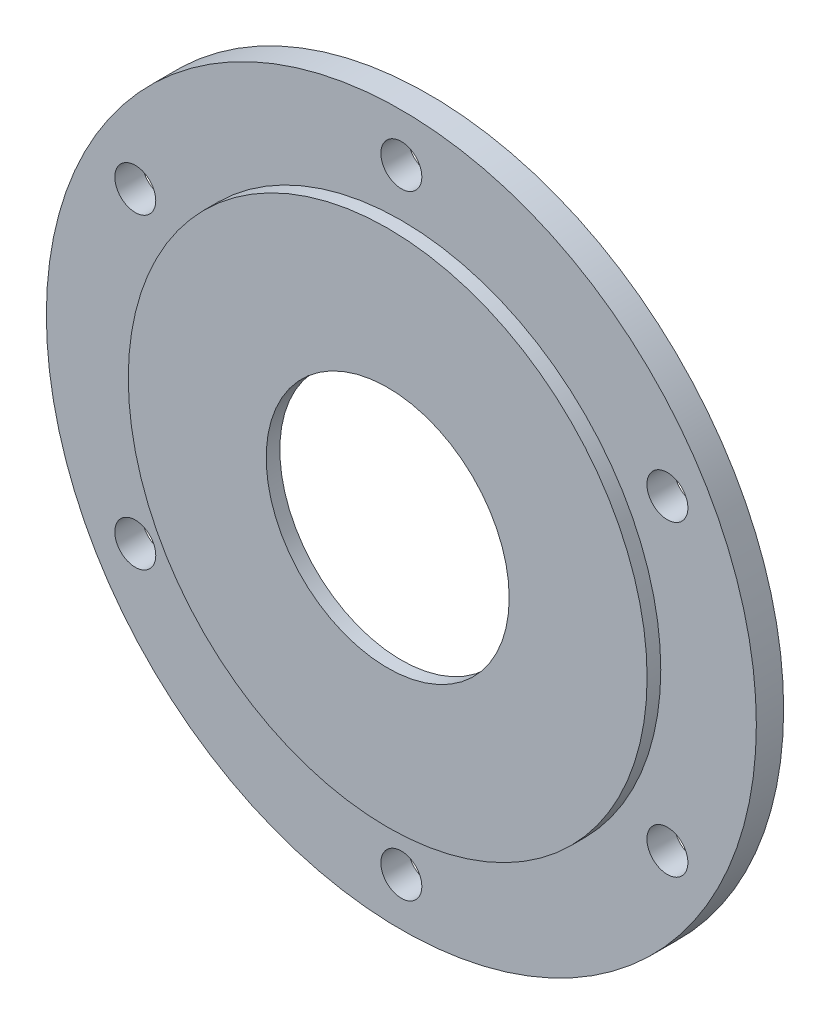
ISO-10303-21;
HEADER;
FILE_DESCRIPTION(('STEP AP214'),'2;1');
FILE_NAME('part.step','',(''),(''),'','','');
FILE_SCHEMA(('AUTOMOTIVE_DESIGN { 1 0 10303 214 1 1 1 1 }'));
ENDSEC;
DATA;
#1=APPLICATION_CONTEXT('core data for automotive mechanical design processes');
#2=APPLICATION_PROTOCOL_DEFINITION('international standard','automotive_design',2000,#1);
#3=PRODUCT_CONTEXT('',#1,'mechanical');
#4=PRODUCT('Part','Part','',(#3));
#5=PRODUCT_RELATED_PRODUCT_CATEGORY('part','',(#4));
#6=PRODUCT_DEFINITION_FORMATION('','',#4);
#7=PRODUCT_DEFINITION_CONTEXT('part definition',#1,'design');
#8=PRODUCT_DEFINITION('design','',#6,#7);
#9=PRODUCT_DEFINITION_SHAPE('','',#8);
#10=(LENGTH_UNIT() NAMED_UNIT(*) SI_UNIT(.MILLI.,.METRE.));
#11=(NAMED_UNIT(*) PLANE_ANGLE_UNIT() SI_UNIT($,.RADIAN.));
#12=(NAMED_UNIT(*) SI_UNIT($,.STERADIAN.) SOLID_ANGLE_UNIT());
#13=UNCERTAINTY_MEASURE_WITH_UNIT(LENGTH_MEASURE(1.E-05),#10,'distance_accuracy_value','');
#14=(GEOMETRIC_REPRESENTATION_CONTEXT(3) GLOBAL_UNCERTAINTY_ASSIGNED_CONTEXT((#13)) GLOBAL_UNIT_ASSIGNED_CONTEXT((#10,
#11,#12)) REPRESENTATION_CONTEXT('',''));
#15=CARTESIAN_POINT('',(0.,0.,0.));
#16=DIRECTION('',(0.,0.,1.));
#17=DIRECTION('',(1.,0.,0.));
#18=AXIS2_PLACEMENT_3D('',#15,#16,#17);
#19=CARTESIAN_POINT('',(0.,0.,-2.));
#20=DIRECTION('',(0.,0.,-1.));
#21=DIRECTION('',(-1.,0.,0.));
#22=AXIS2_PLACEMENT_3D('',#19,#20,#21);
#23=PLANE('',#22);
#24=CARTESIAN_POINT('',(0.,22.5,-2.));
#25=DIRECTION('',(0.,0.,-1.));
#26=DIRECTION('',(-1.,0.,0.));
#27=AXIS2_PLACEMENT_3D('',#24,#25,#26);
#28=CIRCLE('',#27,1.5);
#29=CARTESIAN_POINT('',(-1.5,22.5,-2.));
#30=VERTEX_POINT('',#29);
#31=EDGE_CURVE('E64',#30,#30,#28,.T.);
#32=ORIENTED_EDGE('',*,*,#31,.F.);
#33=EDGE_LOOP('',(#32));
#34=FACE_BOUND('',#33,.T.);
#35=CARTESIAN_POINT('',(-19.4855715851494,11.2499999999992,-2.));
#36=DIRECTION('',(0.,0.,-1.));
#37=DIRECTION('',(-1.,0.,0.));
#38=AXIS2_PLACEMENT_3D('',#35,#36,#37);
#39=CIRCLE('',#38,1.5);
#40=CARTESIAN_POINT('',(-20.9855715851494,11.2499999999992,-2.));
#41=VERTEX_POINT('',#40);
#42=EDGE_CURVE('E71',#41,#41,#39,.T.);
#43=ORIENTED_EDGE('',*,*,#42,.F.);
#44=EDGE_LOOP('',(#43));
#45=FACE_BOUND('',#44,.T.);
#46=CARTESIAN_POINT('',(-19.4855715851484,-11.2500000000008,-2.));
#47=DIRECTION('',(0.,0.,-1.));
#48=DIRECTION('',(-1.,0.,0.));
#49=AXIS2_PLACEMENT_3D('',#46,#47,#48);
#50=CIRCLE('',#49,1.5);
#51=CARTESIAN_POINT('',(-20.9855715851484,-11.2500000000008,-2.));
#52=VERTEX_POINT('',#51);
#53=EDGE_CURVE('E75',#52,#52,#50,.T.);
#54=ORIENTED_EDGE('',*,*,#53,.F.);
#55=EDGE_LOOP('',(#54));
#56=FACE_BOUND('',#55,.T.);
#57=CARTESIAN_POINT('',(1.9099540912982E-12,-22.5,-2.));
#58=DIRECTION('',(0.,0.,-1.));
#59=DIRECTION('',(-1.,0.,0.));
#60=AXIS2_PLACEMENT_3D('',#57,#58,#59);
#61=CIRCLE('',#60,1.5);
#62=CARTESIAN_POINT('',(-1.49999999999809,-22.5,-2.));
#63=VERTEX_POINT('',#62);
#64=EDGE_CURVE('E79',#63,#63,#61,.T.);
#65=ORIENTED_EDGE('',*,*,#64,.F.);
#66=EDGE_LOOP('',(#65));
#67=FACE_BOUND('',#66,.T.);
#68=CARTESIAN_POINT('',(19.4855715851513,-11.2499999999992,-2.));
#69=DIRECTION('',(0.,0.,-1.));
#70=DIRECTION('',(-1.,0.,0.));
#71=AXIS2_PLACEMENT_3D('',#68,#69,#70);
#72=CIRCLE('',#71,1.5);
#73=CARTESIAN_POINT('',(17.9855715851513,-11.2499999999992,-2.));
#74=VERTEX_POINT('',#73);
#75=EDGE_CURVE('E83',#74,#74,#72,.T.);
#76=ORIENTED_EDGE('',*,*,#75,.F.);
#77=EDGE_LOOP('',(#76));
#78=FACE_BOUND('',#77,.T.);
#79=CARTESIAN_POINT('',(19.4855715851503,11.2500000000008,-2.));
#80=DIRECTION('',(0.,0.,-1.));
#81=DIRECTION('',(-1.,0.,0.));
#82=AXIS2_PLACEMENT_3D('',#79,#80,#81);
#83=CIRCLE('',#82,1.5);
#84=CARTESIAN_POINT('',(17.9855715851503,11.2500000000008,-2.));
#85=VERTEX_POINT('',#84);
#86=EDGE_CURVE('E87',#85,#85,#83,.T.);
#87=ORIENTED_EDGE('',*,*,#86,.F.);
#88=EDGE_LOOP('',(#87));
#89=FACE_BOUND('',#88,.T.);
#90=CARTESIAN_POINT('',(0.,0.,-2.));
#91=DIRECTION('',(0.,0.,-1.));
#92=DIRECTION('',(-1.,0.,0.));
#93=AXIS2_PLACEMENT_3D('',#90,#91,#92);
#94=CIRCLE('',#93,26.);
#95=CARTESIAN_POINT('',(-26.,0.,-2.));
#96=VERTEX_POINT('',#95);
#97=EDGE_CURVE('E11',#96,#96,#94,.T.);
#98=ORIENTED_EDGE('',*,*,#97,.T.);
#99=EDGE_LOOP('',(#98));
#100=FACE_BOUND('',#99,.T.);
#101=CARTESIAN_POINT('',(0.,0.,-2.));
#102=DIRECTION('',(0.,0.,-1.));
#103=DIRECTION('',(-1.,0.,0.));
#104=AXIS2_PLACEMENT_3D('',#101,#102,#103);
#105=CIRCLE('',#104,19.);
#106=CARTESIAN_POINT('',(-19.,0.,-2.));
#107=VERTEX_POINT('',#106);
#108=EDGE_CURVE('E58',#107,#107,#105,.T.);
#109=ORIENTED_EDGE('',*,*,#108,.F.);
#110=EDGE_LOOP('',(#109));
#111=FACE_BOUND('',#110,.T.);
#112=ADVANCED_FACE('F45',(#34,#45,#56,#67,#78,#89,#100,#111),#23,.T.);
#113=CARTESIAN_POINT('',(0.,0.,0.));
#114=DIRECTION('',(0.,0.,-1.));
#115=DIRECTION('',(-1.,0.,0.));
#116=AXIS2_PLACEMENT_3D('',#113,#114,#115);
#117=PLANE('',#116);
#118=CARTESIAN_POINT('',(0.,22.5,0.));
#119=DIRECTION('',(0.,0.,1.));
#120=DIRECTION('',(1.,0.,0.));
#121=AXIS2_PLACEMENT_3D('',#118,#119,#120);
#122=CIRCLE('',#121,1.5);
#123=CARTESIAN_POINT('',(1.5,22.5,0.));
#124=VERTEX_POINT('',#123);
#125=EDGE_CURVE('E91',#124,#124,#122,.T.);
#126=ORIENTED_EDGE('',*,*,#125,.F.);
#127=EDGE_LOOP('',(#126));
#128=FACE_BOUND('',#127,.T.);
#129=CARTESIAN_POINT('',(-19.4855715851494,11.2499999999992,0.));
#130=DIRECTION('',(0.,0.,1.));
#131=DIRECTION('',(1.,0.,0.));
#132=AXIS2_PLACEMENT_3D('',#129,#130,#131);
#133=CIRCLE('',#132,1.5);
#134=CARTESIAN_POINT('',(-17.9855715851494,11.2499999999992,0.));
#135=VERTEX_POINT('',#134);
#136=EDGE_CURVE('E97',#135,#135,#133,.T.);
#137=ORIENTED_EDGE('',*,*,#136,.F.);
#138=EDGE_LOOP('',(#137));
#139=FACE_BOUND('',#138,.T.);
#140=CARTESIAN_POINT('',(-19.4855715851484,-11.2500000000008,0.));
#141=DIRECTION('',(0.,0.,1.));
#142=DIRECTION('',(1.,0.,0.));
#143=AXIS2_PLACEMENT_3D('',#140,#141,#142);
#144=CIRCLE('',#143,1.5);
#145=CARTESIAN_POINT('',(-17.9855715851484,-11.2500000000008,0.));
#146=VERTEX_POINT('',#145);
#147=EDGE_CURVE('E92',#146,#146,#144,.T.);
#148=ORIENTED_EDGE('',*,*,#147,.F.);
#149=EDGE_LOOP('',(#148));
#150=FACE_BOUND('',#149,.T.);
#151=CARTESIAN_POINT('',(1.9099540912982E-12,-22.5,0.));
#152=DIRECTION('',(0.,0.,1.));
#153=DIRECTION('',(1.,0.,0.));
#154=AXIS2_PLACEMENT_3D('',#151,#152,#153);
#155=CIRCLE('',#154,1.5);
#156=CARTESIAN_POINT('',(1.50000000000191,-22.5,0.));
#157=VERTEX_POINT('',#156);
#158=EDGE_CURVE('E96',#157,#157,#155,.T.);
#159=ORIENTED_EDGE('',*,*,#158,.F.);
#160=EDGE_LOOP('',(#159));
#161=FACE_BOUND('',#160,.T.);
#162=CARTESIAN_POINT('',(19.4855715851513,-11.2499999999992,0.));
#163=DIRECTION('',(0.,0.,1.));
#164=DIRECTION('',(1.,0.,0.));
#165=AXIS2_PLACEMENT_3D('',#162,#163,#164);
#166=CIRCLE('',#165,1.5);
#167=CARTESIAN_POINT('',(20.9855715851513,-11.2499999999992,0.));
#168=VERTEX_POINT('',#167);
#169=EDGE_CURVE('E101',#168,#168,#166,.T.);
#170=ORIENTED_EDGE('',*,*,#169,.F.);
#171=EDGE_LOOP('',(#170));
#172=FACE_BOUND('',#171,.T.);
#173=CARTESIAN_POINT('',(19.4855715851503,11.2500000000008,0.));
#174=DIRECTION('',(0.,0.,1.));
#175=DIRECTION('',(1.,0.,0.));
#176=AXIS2_PLACEMENT_3D('',#173,#174,#175);
#177=CIRCLE('',#176,1.5);
#178=CARTESIAN_POINT('',(20.9855715851503,11.2500000000008,0.));
#179=VERTEX_POINT('',#178);
#180=EDGE_CURVE('E105',#179,#179,#177,.T.);
#181=ORIENTED_EDGE('',*,*,#180,.F.);
#182=EDGE_LOOP('',(#181));
#183=FACE_BOUND('',#182,.T.);
#184=CARTESIAN_POINT('',(0.,0.,0.));
#185=DIRECTION('',(0.,0.,-1.));
#186=DIRECTION('',(-1.,0.,0.));
#187=AXIS2_PLACEMENT_3D('',#184,#185,#186);
#188=CIRCLE('',#187,26.);
#189=CARTESIAN_POINT('',(-26.,0.,0.));
#190=VERTEX_POINT('',#189);
#191=EDGE_CURVE('E49',#190,#190,#188,.T.);
#192=ORIENTED_EDGE('',*,*,#191,.F.);
#193=EDGE_LOOP('',(#192));
#194=FACE_BOUND('',#193,.T.);
#195=CARTESIAN_POINT('',(0.,0.,0.));
#196=DIRECTION('',(0.,0.,-1.));
#197=DIRECTION('',(-1.,0.,0.));
#198=AXIS2_PLACEMENT_3D('',#195,#196,#197);
#199=CIRCLE('',#198,19.);
#200=CARTESIAN_POINT('',(-19.,0.,0.));
#201=VERTEX_POINT('',#200);
#202=EDGE_CURVE('E60',#201,#201,#199,.T.);
#203=ORIENTED_EDGE('',*,*,#202,.T.);
#204=EDGE_LOOP('',(#203));
#205=FACE_BOUND('',#204,.T.);
#206=ADVANCED_FACE('F118',(#128,#139,#150,#161,#172,#183,#194,#205),#117,.F.);
#207=CARTESIAN_POINT('',(0.,0.,-2.));
#208=DIRECTION('',(0.,0.,1.));
#209=DIRECTION('',(1.,0.,0.));
#210=AXIS2_PLACEMENT_3D('',#207,#208,#209);
#211=CYLINDRICAL_SURFACE('',#210,26.);
#212=ORIENTED_EDGE('',*,*,#97,.F.);
#213=EDGE_LOOP('',(#212));
#214=FACE_BOUND('',#213,.T.);
#215=ORIENTED_EDGE('',*,*,#191,.T.);
#216=EDGE_LOOP('',(#215));
#217=FACE_BOUND('',#216,.T.);
#218=ADVANCED_FACE('F47',(#214,#217),#211,.T.);
#219=CARTESIAN_POINT('',(0.,0.,-2.));
#220=DIRECTION('',(0.,0.,1.));
#221=DIRECTION('',(1.,0.,0.));
#222=AXIS2_PLACEMENT_3D('',#219,#220,#221);
#223=CYLINDRICAL_SURFACE('',#222,19.);
#224=ORIENTED_EDGE('',*,*,#108,.T.);
#225=EDGE_LOOP('',(#224));
#226=FACE_BOUND('',#225,.T.);
#227=ORIENTED_EDGE('',*,*,#202,.F.);
#228=EDGE_LOOP('',(#227));
#229=FACE_BOUND('',#228,.T.);
#230=ADVANCED_FACE('F135',(#226,#229),#223,.F.);
#231=CARTESIAN_POINT('',(19.4855715851503,11.2500000000008,-3.));
#232=DIRECTION('',(0.,0.,1.));
#233=DIRECTION('',(1.,0.,0.));
#234=AXIS2_PLACEMENT_3D('',#231,#232,#233);
#235=CYLINDRICAL_SURFACE('',#234,1.5);
#236=ORIENTED_EDGE('',*,*,#86,.T.);
#237=EDGE_LOOP('',(#236));
#238=FACE_BOUND('',#237,.T.);
#239=ORIENTED_EDGE('',*,*,#180,.T.);
#240=EDGE_LOOP('',(#239));
#241=FACE_BOUND('',#240,.T.);
#242=ADVANCED_FACE('F137',(#238,#241),#235,.F.);
#243=CARTESIAN_POINT('',(19.4855715851513,-11.2499999999992,-3.));
#244=DIRECTION('',(0.,0.,1.));
#245=DIRECTION('',(1.,0.,0.));
#246=AXIS2_PLACEMENT_3D('',#243,#244,#245);
#247=CYLINDRICAL_SURFACE('',#246,1.5);
#248=ORIENTED_EDGE('',*,*,#75,.T.);
#249=EDGE_LOOP('',(#248));
#250=FACE_BOUND('',#249,.T.);
#251=ORIENTED_EDGE('',*,*,#169,.T.);
#252=EDGE_LOOP('',(#251));
#253=FACE_BOUND('',#252,.T.);
#254=ADVANCED_FACE('F144',(#250,#253),#247,.F.);
#255=CARTESIAN_POINT('',(1.9099540912982E-12,-22.5,-3.));
#256=DIRECTION('',(0.,0.,1.));
#257=DIRECTION('',(1.,0.,0.));
#258=AXIS2_PLACEMENT_3D('',#255,#256,#257);
#259=CYLINDRICAL_SURFACE('',#258,1.5);
#260=ORIENTED_EDGE('',*,*,#64,.T.);
#261=EDGE_LOOP('',(#260));
#262=FACE_BOUND('',#261,.T.);
#263=ORIENTED_EDGE('',*,*,#158,.T.);
#264=EDGE_LOOP('',(#263));
#265=FACE_BOUND('',#264,.T.);
#266=ADVANCED_FACE('F171',(#262,#265),#259,.F.);
#267=CARTESIAN_POINT('',(-19.4855715851484,-11.2500000000008,-3.));
#268=DIRECTION('',(0.,0.,1.));
#269=DIRECTION('',(1.,0.,0.));
#270=AXIS2_PLACEMENT_3D('',#267,#268,#269);
#271=CYLINDRICAL_SURFACE('',#270,1.5);
#272=ORIENTED_EDGE('',*,*,#53,.T.);
#273=EDGE_LOOP('',(#272));
#274=FACE_BOUND('',#273,.T.);
#275=ORIENTED_EDGE('',*,*,#147,.T.);
#276=EDGE_LOOP('',(#275));
#277=FACE_BOUND('',#276,.T.);
#278=ADVANCED_FACE('F176',(#274,#277),#271,.F.);
#279=CARTESIAN_POINT('',(-19.4855715851494,11.2499999999992,-3.));
#280=DIRECTION('',(0.,0.,1.));
#281=DIRECTION('',(1.,0.,0.));
#282=AXIS2_PLACEMENT_3D('',#279,#280,#281);
#283=CYLINDRICAL_SURFACE('',#282,1.5);
#284=ORIENTED_EDGE('',*,*,#42,.T.);
#285=EDGE_LOOP('',(#284));
#286=FACE_BOUND('',#285,.T.);
#287=ORIENTED_EDGE('',*,*,#136,.T.);
#288=EDGE_LOOP('',(#287));
#289=FACE_BOUND('',#288,.T.);
#290=ADVANCED_FACE('F181',(#286,#289),#283,.F.);
#291=CARTESIAN_POINT('',(0.,22.5,-3.));
#292=DIRECTION('',(0.,0.,1.));
#293=DIRECTION('',(1.,0.,0.));
#294=AXIS2_PLACEMENT_3D('',#291,#292,#293);
#295=CYLINDRICAL_SURFACE('',#294,1.5);
#296=ORIENTED_EDGE('',*,*,#31,.T.);
#297=EDGE_LOOP('',(#296));
#298=FACE_BOUND('',#297,.T.);
#299=ORIENTED_EDGE('',*,*,#125,.T.);
#300=EDGE_LOOP('',(#299));
#301=FACE_BOUND('',#300,.T.);
#302=ADVANCED_FACE('F116',(#298,#301),#295,.F.);
#303=CLOSED_SHELL('',(#112,#206,#218,#230,#242,#254,#266,#278,#290,#302));
#304=MANIFOLD_SOLID_BREP('B2',#303);
#305=CARTESIAN_POINT('',(0.,0.,1.));
#306=DIRECTION('',(0.,0.,1.));
#307=DIRECTION('',(1.,0.,0.));
#308=AXIS2_PLACEMENT_3D('',#305,#306,#307);
#309=PLANE('',#308);
#310=CARTESIAN_POINT('',(0.,0.,1.));
#311=DIRECTION('',(0.,0.,1.));
#312=DIRECTION('',(1.,0.,0.));
#313=AXIS2_PLACEMENT_3D('',#310,#311,#312);
#314=CIRCLE('',#313,19.);
#315=CARTESIAN_POINT('',(19.,0.,1.));
#316=VERTEX_POINT('',#315);
#317=EDGE_CURVE('E44',#316,#316,#314,.T.);
#318=ORIENTED_EDGE('',*,*,#317,.T.);
#319=EDGE_LOOP('',(#318));
#320=FACE_BOUND('',#319,.T.);
#321=CARTESIAN_POINT('',(0.,0.,1.));
#322=DIRECTION('',(0.,0.,1.));
#323=DIRECTION('',(1.,0.,0.));
#324=AXIS2_PLACEMENT_3D('',#321,#322,#323);
#325=CIRCLE('',#324,8.9);
#326=CARTESIAN_POINT('',(8.9,0.,1.));
#327=VERTEX_POINT('',#326);
#328=EDGE_CURVE('E260',#327,#327,#325,.T.);
#329=ORIENTED_EDGE('',*,*,#328,.F.);
#330=EDGE_LOOP('',(#329));
#331=FACE_BOUND('',#330,.T.);
#332=ADVANCED_FACE('F249',(#320,#331),#309,.T.);
#333=CARTESIAN_POINT('',(0.,0.,0.));
#334=DIRECTION('',(0.,0.,1.));
#335=DIRECTION('',(1.,0.,0.));
#336=AXIS2_PLACEMENT_3D('',#333,#334,#335);
#337=PLANE('',#336);
#338=CARTESIAN_POINT('',(0.,0.,0.));
#339=DIRECTION('',(0.,0.,1.));
#340=DIRECTION('',(1.,0.,0.));
#341=AXIS2_PLACEMENT_3D('',#338,#339,#340);
#342=CIRCLE('',#341,19.);
#343=CARTESIAN_POINT('',(19.,0.,0.));
#344=VERTEX_POINT('',#343);
#345=EDGE_CURVE('E253',#344,#344,#342,.T.);
#346=ORIENTED_EDGE('',*,*,#345,.F.);
#347=EDGE_LOOP('',(#346));
#348=FACE_BOUND('',#347,.T.);
#349=CARTESIAN_POINT('',(0.,0.,0.));
#350=DIRECTION('',(0.,0.,1.));
#351=DIRECTION('',(1.,0.,0.));
#352=AXIS2_PLACEMENT_3D('',#349,#350,#351);
#353=CIRCLE('',#352,8.9);
#354=CARTESIAN_POINT('',(8.9,0.,0.));
#355=VERTEX_POINT('',#354);
#356=EDGE_CURVE('E262',#355,#355,#353,.T.);
#357=ORIENTED_EDGE('',*,*,#356,.T.);
#358=EDGE_LOOP('',(#357));
#359=FACE_BOUND('',#358,.T.);
#360=ADVANCED_FACE('F272',(#348,#359),#337,.F.);
#361=CARTESIAN_POINT('',(0.,0.,1.));
#362=DIRECTION('',(0.,0.,-1.));
#363=DIRECTION('',(-1.,0.,0.));
#364=AXIS2_PLACEMENT_3D('',#361,#362,#363);
#365=CYLINDRICAL_SURFACE('',#364,19.);
#366=ORIENTED_EDGE('',*,*,#317,.F.);
#367=EDGE_LOOP('',(#366));
#368=FACE_BOUND('',#367,.T.);
#369=ORIENTED_EDGE('',*,*,#345,.T.);
#370=EDGE_LOOP('',(#369));
#371=FACE_BOUND('',#370,.T.);
#372=ADVANCED_FACE('F251',(#368,#371),#365,.T.);
#373=CARTESIAN_POINT('',(0.,0.,1.));
#374=DIRECTION('',(0.,0.,-1.));
#375=DIRECTION('',(-1.,0.,0.));
#376=AXIS2_PLACEMENT_3D('',#373,#374,#375);
#377=CYLINDRICAL_SURFACE('',#376,8.9);
#378=ORIENTED_EDGE('',*,*,#328,.T.);
#379=EDGE_LOOP('',(#378));
#380=FACE_BOUND('',#379,.T.);
#381=ORIENTED_EDGE('',*,*,#356,.F.);
#382=EDGE_LOOP('',(#381));
#383=FACE_BOUND('',#382,.T.);
#384=ADVANCED_FACE('F268',(#380,#383),#377,.F.);
#385=CLOSED_SHELL('',(#332,#360,#372,#384));
#386=MANIFOLD_SOLID_BREP('B6',#385);
#387=ADVANCED_BREP_SHAPE_REPRESENTATION('',(#18,#304,#386),#14);
#388=SHAPE_DEFINITION_REPRESENTATION(#9,#387);
ENDSEC;
END-ISO-10303-21;
